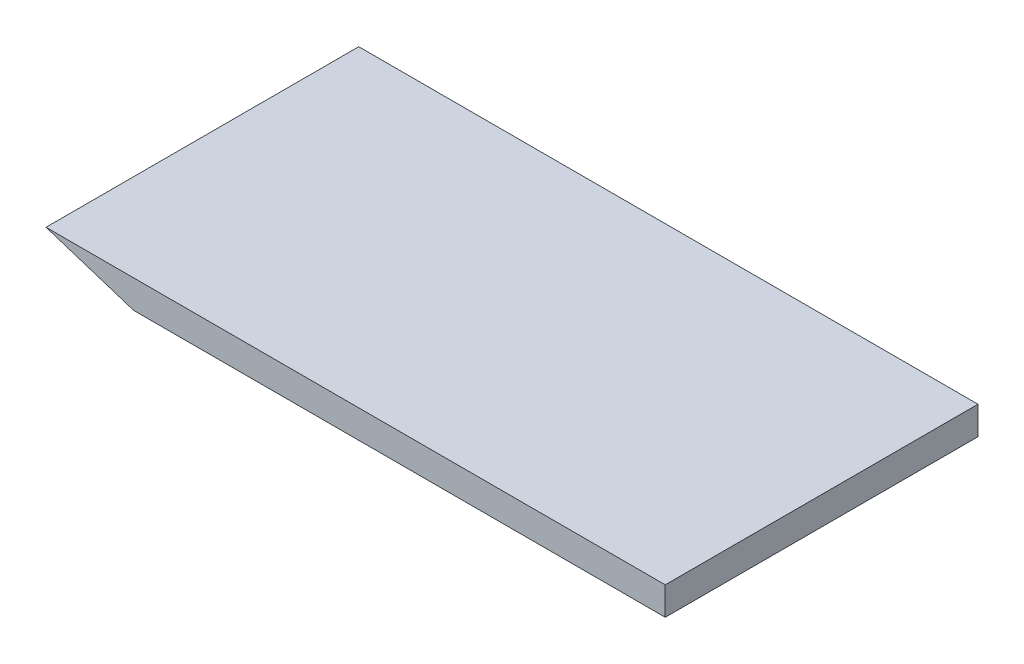
ISO-10303-21;
HEADER;
FILE_DESCRIPTION(('STEP AP214'),'2;1');
FILE_NAME('part.step','',(''),(''),'','','');
FILE_SCHEMA(('AUTOMOTIVE_DESIGN { 1 0 10303 214 1 1 1 1 }'));
ENDSEC;
DATA;
#1=APPLICATION_CONTEXT('core data for automotive mechanical design processes');
#2=APPLICATION_PROTOCOL_DEFINITION('international standard','automotive_design',2000,#1);
#3=PRODUCT_CONTEXT('',#1,'mechanical');
#4=PRODUCT('Part','Part','',(#3));
#5=PRODUCT_RELATED_PRODUCT_CATEGORY('part','',(#4));
#6=PRODUCT_DEFINITION_FORMATION('','',#4);
#7=PRODUCT_DEFINITION_CONTEXT('part definition',#1,'design');
#8=PRODUCT_DEFINITION('design','',#6,#7);
#9=PRODUCT_DEFINITION_SHAPE('','',#8);
#10=(LENGTH_UNIT() NAMED_UNIT(*) SI_UNIT(.MILLI.,.METRE.));
#11=(NAMED_UNIT(*) PLANE_ANGLE_UNIT() SI_UNIT($,.RADIAN.));
#12=(NAMED_UNIT(*) SI_UNIT($,.STERADIAN.) SOLID_ANGLE_UNIT());
#13=UNCERTAINTY_MEASURE_WITH_UNIT(LENGTH_MEASURE(1.E-05),#10,'distance_accuracy_value','');
#14=(GEOMETRIC_REPRESENTATION_CONTEXT(3) GLOBAL_UNCERTAINTY_ASSIGNED_CONTEXT((#13)) GLOBAL_UNIT_ASSIGNED_CONTEXT((#10,
#11,#12)) REPRESENTATION_CONTEXT('',''));
#15=CARTESIAN_POINT('',(0.,0.,0.));
#16=DIRECTION('',(0.,0.,1.));
#17=DIRECTION('',(1.,0.,0.));
#18=AXIS2_PLACEMENT_3D('',#15,#16,#17);
#19=CARTESIAN_POINT('',(198.,-9.00000000000001,100.));
#20=DIRECTION('',(0.,-1.,0.));
#21=DIRECTION('',(1.,0.,0.));
#22=AXIS2_PLACEMENT_3D('',#19,#20,#21);
#23=PLANE('',#22);
#24=DIRECTION('',(-1.,0.,0.));
#25=VECTOR('',#24,1.);
#26=CARTESIAN_POINT('',(198.,-9.00000000000001,0.));
#27=LINE('',#26,#25);
#28=CARTESIAN_POINT('',(198.,-9.00000000000001,0.));
#29=VERTEX_POINT('',#28);
#30=CARTESIAN_POINT('',(28.,-9.00000000000004,0.));
#31=VERTEX_POINT('',#30);
#32=EDGE_CURVE('E109',#29,#31,#27,.T.);
#33=ORIENTED_EDGE('',*,*,#32,.F.);
#34=DIRECTION('',(0.,0.,-1.));
#35=VECTOR('',#34,1.);
#36=CARTESIAN_POINT('',(198.,-9.00000000000001,100.));
#37=LINE('',#36,#35);
#38=CARTESIAN_POINT('',(198.,-9.00000000000001,100.));
#39=VERTEX_POINT('',#38);
#40=EDGE_CURVE('E11',#39,#29,#37,.T.);
#41=ORIENTED_EDGE('',*,*,#40,.F.);
#42=DIRECTION('',(-1.,0.,0.));
#43=VECTOR('',#42,1.);
#44=CARTESIAN_POINT('',(198.,-9.00000000000001,100.));
#45=LINE('',#44,#43);
#46=CARTESIAN_POINT('',(28.,-9.00000000000004,100.));
#47=VERTEX_POINT('',#46);
#48=EDGE_CURVE('E101',#39,#47,#45,.T.);
#49=ORIENTED_EDGE('',*,*,#48,.T.);
#50=DIRECTION('',(0.,0.,-1.));
#51=VECTOR('',#50,1.);
#52=CARTESIAN_POINT('',(28.,-9.00000000000004,100.));
#53=LINE('',#52,#51);
#54=EDGE_CURVE('E42',#47,#31,#53,.T.);
#55=ORIENTED_EDGE('',*,*,#54,.T.);
#56=EDGE_LOOP('',(#33,#41,#49,#55));
#57=FACE_BOUND('',#56,.T.);
#58=ADVANCED_FACE('F39',(#57),#23,.T.);
#59=CARTESIAN_POINT('',(198.,0.,100.));
#60=DIRECTION('',(1.,0.,0.));
#61=DIRECTION('',(0.,0.,-1.));
#62=AXIS2_PLACEMENT_3D('',#59,#60,#61);
#63=PLANE('',#62);
#64=DIRECTION('',(0.,-1.,0.));
#65=VECTOR('',#64,1.);
#66=CARTESIAN_POINT('',(198.,0.,0.));
#67=LINE('',#66,#65);
#68=CARTESIAN_POINT('',(198.,0.,0.));
#69=VERTEX_POINT('',#68);
#70=EDGE_CURVE('E104',#69,#29,#67,.T.);
#71=ORIENTED_EDGE('',*,*,#70,.F.);
#72=DIRECTION('',(0.,0.,-1.));
#73=VECTOR('',#72,1.);
#74=CARTESIAN_POINT('',(198.,0.,100.));
#75=LINE('',#74,#73);
#76=CARTESIAN_POINT('',(198.,0.,100.));
#77=VERTEX_POINT('',#76);
#78=EDGE_CURVE('E49',#77,#69,#75,.T.);
#79=ORIENTED_EDGE('',*,*,#78,.F.);
#80=DIRECTION('',(0.,-1.,0.));
#81=VECTOR('',#80,1.);
#82=CARTESIAN_POINT('',(198.,0.,100.));
#83=LINE('',#82,#81);
#84=EDGE_CURVE('E96',#77,#39,#83,.T.);
#85=ORIENTED_EDGE('',*,*,#84,.T.);
#86=ORIENTED_EDGE('',*,*,#40,.T.);
#87=EDGE_LOOP('',(#71,#79,#85,#86));
#88=FACE_BOUND('',#87,.T.);
#89=ADVANCED_FACE('F125',(#88),#63,.T.);
#90=CARTESIAN_POINT('',(0.,0.,100.));
#91=DIRECTION('',(0.,1.,0.));
#92=DIRECTION('',(0.,0.,1.));
#93=AXIS2_PLACEMENT_3D('',#90,#91,#92);
#94=PLANE('',#93);
#95=DIRECTION('',(1.,0.,0.));
#96=VECTOR('',#95,1.);
#97=CARTESIAN_POINT('',(0.,0.,0.));
#98=LINE('',#97,#96);
#99=CARTESIAN_POINT('',(0.,0.,0.));
#100=VERTEX_POINT('',#99);
#101=EDGE_CURVE('E90',#100,#69,#98,.T.);
#102=ORIENTED_EDGE('',*,*,#101,.F.);
#103=DIRECTION('',(0.,0.,-1.));
#104=VECTOR('',#103,1.);
#105=CARTESIAN_POINT('',(0.,0.,100.));
#106=LINE('',#105,#104);
#107=CARTESIAN_POINT('',(0.,0.,100.));
#108=VERTEX_POINT('',#107);
#109=EDGE_CURVE('E85',#108,#100,#106,.T.);
#110=ORIENTED_EDGE('',*,*,#109,.F.);
#111=DIRECTION('',(1.,0.,0.));
#112=VECTOR('',#111,1.);
#113=CARTESIAN_POINT('',(0.,0.,100.));
#114=LINE('',#113,#112);
#115=EDGE_CURVE('E88',#108,#77,#114,.T.);
#116=ORIENTED_EDGE('',*,*,#115,.T.);
#117=ORIENTED_EDGE('',*,*,#78,.T.);
#118=EDGE_LOOP('',(#102,#110,#116,#117));
#119=FACE_BOUND('',#118,.T.);
#120=ADVANCED_FACE('F87',(#119),#94,.T.);
#121=CARTESIAN_POINT('',(28.,-9.00000000000004,100.));
#122=DIRECTION('',(-0.306009180413122,-0.952028561285264,0.));
#123=DIRECTION('',(0.952028561285264,-0.306009180413122,0.));
#124=AXIS2_PLACEMENT_3D('',#121,#122,#123);
#125=PLANE('',#124);
#126=DIRECTION('',(-0.952028561285264,0.306009180413122,0.));
#127=VECTOR('',#126,1.);
#128=CARTESIAN_POINT('',(28.,-9.00000000000004,0.));
#129=LINE('',#128,#127);
#130=EDGE_CURVE('E113',#31,#100,#129,.T.);
#131=ORIENTED_EDGE('',*,*,#130,.F.);
#132=ORIENTED_EDGE('',*,*,#54,.F.);
#133=DIRECTION('',(-0.952028561285264,0.306009180413122,0.));
#134=VECTOR('',#133,1.);
#135=CARTESIAN_POINT('',(28.,-9.00000000000004,100.));
#136=LINE('',#135,#134);
#137=EDGE_CURVE('E95',#47,#108,#136,.T.);
#138=ORIENTED_EDGE('',*,*,#137,.T.);
#139=ORIENTED_EDGE('',*,*,#109,.T.);
#140=EDGE_LOOP('',(#131,#132,#138,#139));
#141=FACE_BOUND('',#140,.T.);
#142=ADVANCED_FACE('F99',(#141),#125,.T.);
#143=CARTESIAN_POINT('',(0.,0.,100.));
#144=DIRECTION('',(0.,0.,1.));
#145=DIRECTION('',(1.,0.,0.));
#146=AXIS2_PLACEMENT_3D('',#143,#144,#145);
#147=PLANE('',#146);
#148=ORIENTED_EDGE('',*,*,#48,.F.);
#149=ORIENTED_EDGE('',*,*,#84,.F.);
#150=ORIENTED_EDGE('',*,*,#115,.F.);
#151=ORIENTED_EDGE('',*,*,#137,.F.);
#152=EDGE_LOOP('',(#148,#149,#150,#151));
#153=FACE_BOUND('',#152,.T.);
#154=ADVANCED_FACE('F94',(#153),#147,.T.);
#155=CARTESIAN_POINT('',(0.,0.,0.));
#156=DIRECTION('',(0.,0.,1.));
#157=DIRECTION('',(1.,0.,0.));
#158=AXIS2_PLACEMENT_3D('',#155,#156,#157);
#159=PLANE('',#158);
#160=ORIENTED_EDGE('',*,*,#32,.T.);
#161=ORIENTED_EDGE('',*,*,#130,.T.);
#162=ORIENTED_EDGE('',*,*,#101,.T.);
#163=ORIENTED_EDGE('',*,*,#70,.T.);
#164=EDGE_LOOP('',(#160,#161,#162,#163));
#165=FACE_BOUND('',#164,.T.);
#166=ADVANCED_FACE('F124',(#165),#159,.F.);
#167=CLOSED_SHELL('',(#58,#89,#120,#142,#154,#166));
#168=MANIFOLD_SOLID_BREP('B2',#167);
#169=ADVANCED_BREP_SHAPE_REPRESENTATION('',(#18,#168),#14);
#170=SHAPE_DEFINITION_REPRESENTATION(#9,#169);
ENDSEC;
END-ISO-10303-21;
